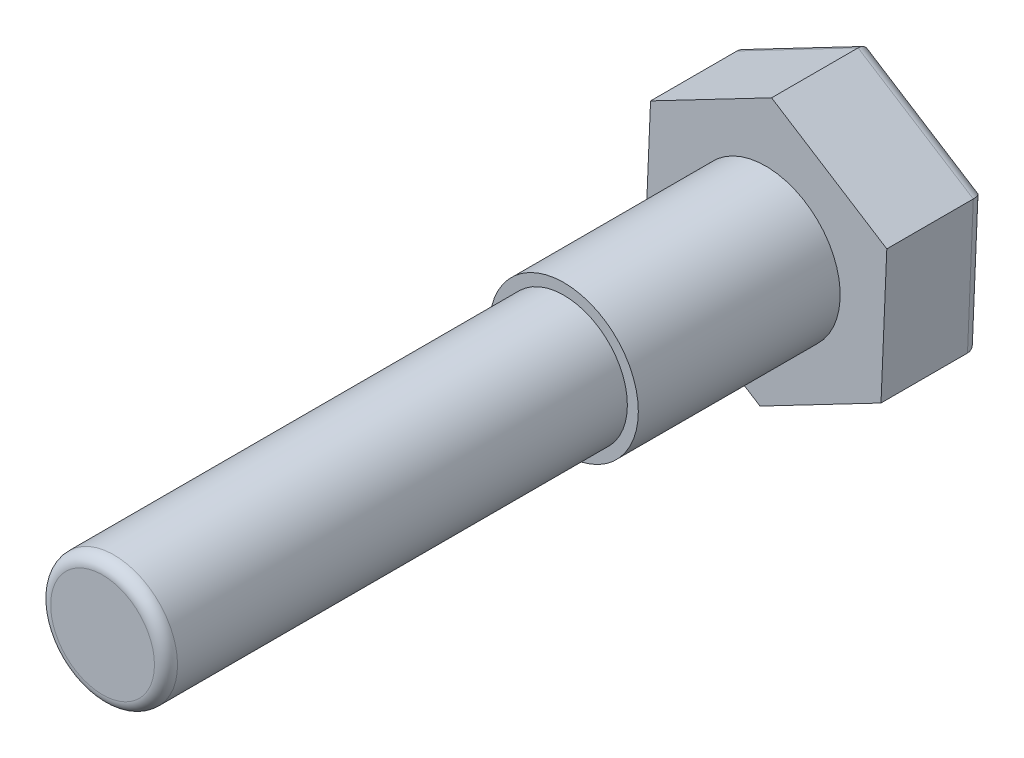
ISO-10303-21;
HEADER;
FILE_DESCRIPTION(('STEP AP214'),'2;1');
FILE_NAME('part.step','',(''),(''),'','','');
FILE_SCHEMA(('AUTOMOTIVE_DESIGN { 1 0 10303 214 1 1 1 1 }'));
ENDSEC;
DATA;
#1=APPLICATION_CONTEXT('core data for automotive mechanical design processes');
#2=APPLICATION_PROTOCOL_DEFINITION('international standard','automotive_design',2000,#1);
#3=PRODUCT_CONTEXT('',#1,'mechanical');
#4=PRODUCT('Part','Part','',(#3));
#5=PRODUCT_RELATED_PRODUCT_CATEGORY('part','',(#4));
#6=PRODUCT_DEFINITION_FORMATION('','',#4);
#7=PRODUCT_DEFINITION_CONTEXT('part definition',#1,'design');
#8=PRODUCT_DEFINITION('design','',#6,#7);
#9=PRODUCT_DEFINITION_SHAPE('','',#8);
#10=(LENGTH_UNIT() NAMED_UNIT(*) SI_UNIT(.MILLI.,.METRE.));
#11=(NAMED_UNIT(*) PLANE_ANGLE_UNIT() SI_UNIT($,.RADIAN.));
#12=(NAMED_UNIT(*) SI_UNIT($,.STERADIAN.) SOLID_ANGLE_UNIT());
#13=UNCERTAINTY_MEASURE_WITH_UNIT(LENGTH_MEASURE(1.E-05),#10,'distance_accuracy_value','');
#14=(GEOMETRIC_REPRESENTATION_CONTEXT(3) GLOBAL_UNCERTAINTY_ASSIGNED_CONTEXT((#13)) GLOBAL_UNIT_ASSIGNED_CONTEXT((#10,
#11,#12)) REPRESENTATION_CONTEXT('',''));
#15=CARTESIAN_POINT('',(0.,0.,0.));
#16=DIRECTION('',(0.,0.,1.));
#17=DIRECTION('',(1.,0.,0.));
#18=AXIS2_PLACEMENT_3D('',#15,#16,#17);
#19=CARTESIAN_POINT('',(19.9787997617734,-12.6957037383635,17.));
#20=DIRECTION('',(-0.999097599975706,0.0424733530909036,0.));
#21=DIRECTION('',(-0.0424733530909036,-0.999097599975706,0.));
#22=AXIS2_PLACEMENT_3D('',#19,#20,#21);
#23=PLANE('',#22);
#24=DIRECTION('',(0.,0.,-1.));
#25=VECTOR('',#24,1.);
#26=CARTESIAN_POINT('',(19.9787997617734,-12.6957037383635,17.));
#27=LINE('',#26,#25);
#28=CARTESIAN_POINT('',(19.9787997617734,-12.6957037383635,17.));
#29=VERTEX_POINT('',#28);
#30=CARTESIAN_POINT('',(19.9787997617734,-12.6957037383635,2.));
#31=VERTEX_POINT('',#30);
#32=EDGE_CURVE('E257',#29,#31,#27,.T.);
#33=ORIENTED_EDGE('',*,*,#32,.T.);
#34=DIRECTION('',(0.0424733530909036,0.999097599975706,0.));
#35=VECTOR('',#34,1.);
#36=CARTESIAN_POINT('',(20.9842018372306,10.9542962616365,2.));
#37=LINE('',#36,#35);
#38=CARTESIAN_POINT('',(20.9842018372306,10.9542962616365,2.));
#39=VERTEX_POINT('',#38);
#40=EDGE_CURVE('E132',#31,#39,#37,.T.);
#41=ORIENTED_EDGE('',*,*,#40,.T.);
#42=DIRECTION('',(0.,0.,-1.));
#43=VECTOR('',#42,1.);
#44=CARTESIAN_POINT('',(20.9842018372306,10.9542962616365,17.));
#45=LINE('',#44,#43);
#46=CARTESIAN_POINT('',(20.9842018372306,10.9542962616365,17.));
#47=VERTEX_POINT('',#46);
#48=EDGE_CURVE('E115',#47,#39,#45,.T.);
#49=ORIENTED_EDGE('',*,*,#48,.F.);
#50=DIRECTION('',(0.0424733530909036,0.999097599975706,0.));
#51=VECTOR('',#50,1.);
#52=CARTESIAN_POINT('',(19.9787997617734,-12.6957037383635,17.));
#53=LINE('',#52,#51);
#54=EDGE_CURVE('E122',#29,#47,#53,.T.);
#55=ORIENTED_EDGE('',*,*,#54,.F.);
#56=EDGE_LOOP('',(#33,#41,#49,#55));
#57=FACE_BOUND('',#56,.T.);
#58=ADVANCED_FACE('F36',(#57),#23,.F.);
#59=CARTESIAN_POINT('',(20.9842018372306,10.9542962616365,17.));
#60=DIRECTION('',(-0.536331802748482,-0.844007225893572,0.));
#61=DIRECTION('',(0.844007225893572,-0.536331802748482,0.));
#62=AXIS2_PLACEMENT_3D('',#59,#60,#61);
#63=PLANE('',#62);
#64=ORIENTED_EDGE('',*,*,#48,.T.);
#65=DIRECTION('',(-0.844007225893572,0.536331802748482,0.));
#66=VECTOR('',#65,1.);
#67=CARTESIAN_POINT('',(1.00540207545719,23.65,2.));
#68=LINE('',#67,#66);
#69=CARTESIAN_POINT('',(1.0054020754572,23.65,2.));
#70=VERTEX_POINT('',#69);
#71=EDGE_CURVE('E136',#39,#70,#68,.T.);
#72=ORIENTED_EDGE('',*,*,#71,.T.);
#73=DIRECTION('',(0.,0.,-1.));
#74=VECTOR('',#73,1.);
#75=CARTESIAN_POINT('',(1.0054020754572,23.65,17.));
#76=LINE('',#75,#74);
#77=CARTESIAN_POINT('',(1.0054020754572,23.65,17.));
#78=VERTEX_POINT('',#77);
#79=EDGE_CURVE('E118',#78,#70,#76,.T.);
#80=ORIENTED_EDGE('',*,*,#79,.F.);
#81=DIRECTION('',(-0.844007225893572,0.536331802748482,0.));
#82=VECTOR('',#81,1.);
#83=CARTESIAN_POINT('',(20.9842018372306,10.9542962616365,17.));
#84=LINE('',#83,#82);
#85=EDGE_CURVE('E110',#47,#78,#84,.T.);
#86=ORIENTED_EDGE('',*,*,#85,.F.);
#87=EDGE_LOOP('',(#64,#72,#80,#86));
#88=FACE_BOUND('',#87,.T.);
#89=ADVANCED_FACE('F112',(#88),#63,.F.);
#90=CARTESIAN_POINT('',(1.0054020754572,23.65,17.));
#91=DIRECTION('',(0.462765797227231,-0.886480578984472,0.));
#92=DIRECTION('',(0.886480578984472,0.462765797227231,0.));
#93=AXIS2_PLACEMENT_3D('',#90,#91,#92);
#94=PLANE('',#93);
#95=ORIENTED_EDGE('',*,*,#79,.T.);
#96=DIRECTION('',(-0.886480578984472,-0.462765797227231,0.));
#97=VECTOR('',#96,1.);
#98=CARTESIAN_POINT('',(-19.9787997617736,12.6957037383632,2.));
#99=LINE('',#98,#97);
#100=CARTESIAN_POINT('',(-19.9787997617736,12.6957037383632,2.));
#101=VERTEX_POINT('',#100);
#102=EDGE_CURVE('E156',#70,#101,#99,.T.);
#103=ORIENTED_EDGE('',*,*,#102,.T.);
#104=DIRECTION('',(0.,0.,-1.));
#105=VECTOR('',#104,1.);
#106=CARTESIAN_POINT('',(-19.9787997617736,12.6957037383632,17.));
#107=LINE('',#106,#105);
#108=CARTESIAN_POINT('',(-19.9787997617736,12.6957037383632,17.));
#109=VERTEX_POINT('',#108);
#110=EDGE_CURVE('E138',#109,#101,#107,.T.);
#111=ORIENTED_EDGE('',*,*,#110,.F.);
#112=DIRECTION('',(-0.886480578984472,-0.462765797227231,0.));
#113=VECTOR('',#112,1.);
#114=CARTESIAN_POINT('',(1.0054020754572,23.65,17.));
#115=LINE('',#114,#113);
#116=EDGE_CURVE('E121',#78,#109,#115,.T.);
#117=ORIENTED_EDGE('',*,*,#116,.F.);
#118=EDGE_LOOP('',(#95,#103,#111,#117));
#119=FACE_BOUND('',#118,.T.);
#120=ADVANCED_FACE('F197',(#119),#94,.F.);
#121=CARTESIAN_POINT('',(-19.9787997617736,12.6957037383632,17.));
#122=DIRECTION('',(0.999097599975706,-0.0424733530908878,0.));
#123=DIRECTION('',(0.0424733530908878,0.999097599975707,0.));
#124=AXIS2_PLACEMENT_3D('',#121,#122,#123);
#125=PLANE('',#124);
#126=ORIENTED_EDGE('',*,*,#110,.T.);
#127=DIRECTION('',(-0.0424733530908878,-0.999097599975707,0.));
#128=VECTOR('',#127,1.);
#129=CARTESIAN_POINT('',(-20.9842018372304,-10.9542962616368,2.));
#130=LINE('',#129,#128);
#131=CARTESIAN_POINT('',(-20.9842018372304,-10.9542962616368,2.));
#132=VERTEX_POINT('',#131);
#133=EDGE_CURVE('E158',#101,#132,#130,.T.);
#134=ORIENTED_EDGE('',*,*,#133,.T.);
#135=DIRECTION('',(0.,0.,-1.));
#136=VECTOR('',#135,1.);
#137=CARTESIAN_POINT('',(-20.9842018372304,-10.9542962616368,17.));
#138=LINE('',#137,#136);
#139=CARTESIAN_POINT('',(-20.9842018372304,-10.9542962616368,17.));
#140=VERTEX_POINT('',#139);
#141=EDGE_CURVE('E261',#140,#132,#138,.T.);
#142=ORIENTED_EDGE('',*,*,#141,.F.);
#143=DIRECTION('',(-0.0424733530908878,-0.999097599975706,0.));
#144=VECTOR('',#143,1.);
#145=CARTESIAN_POINT('',(-19.9787997617736,12.6957037383632,17.));
#146=LINE('',#145,#144);
#147=EDGE_CURVE('E250',#109,#140,#146,.T.);
#148=ORIENTED_EDGE('',*,*,#147,.F.);
#149=EDGE_LOOP('',(#126,#134,#142,#148));
#150=FACE_BOUND('',#149,.T.);
#151=ADVANCED_FACE('F263',(#150),#125,.F.);
#152=CARTESIAN_POINT('',(-20.9842018372304,-10.9542962616368,17.));
#153=DIRECTION('',(0.536331802748476,0.844007225893576,0.));
#154=DIRECTION('',(-0.844007225893576,0.536331802748476,0.));
#155=AXIS2_PLACEMENT_3D('',#152,#153,#154);
#156=PLANE('',#155);
#157=ORIENTED_EDGE('',*,*,#141,.T.);
#158=DIRECTION('',(0.844007225893576,-0.536331802748476,0.));
#159=VECTOR('',#158,1.);
#160=CARTESIAN_POINT('',(-1.00540207545719,-23.65,2.));
#161=LINE('',#160,#159);
#162=CARTESIAN_POINT('',(-1.00540207545719,-23.65,2.));
#163=VERTEX_POINT('',#162);
#164=EDGE_CURVE('E59',#132,#163,#161,.T.);
#165=ORIENTED_EDGE('',*,*,#164,.T.);
#166=DIRECTION('',(0.,0.,-1.));
#167=VECTOR('',#166,1.);
#168=CARTESIAN_POINT('',(-1.00540207545719,-23.65,17.));
#169=LINE('',#168,#167);
#170=CARTESIAN_POINT('',(-1.00540207545719,-23.65,17.));
#171=VERTEX_POINT('',#170);
#172=EDGE_CURVE('E259',#171,#163,#169,.T.);
#173=ORIENTED_EDGE('',*,*,#172,.F.);
#174=DIRECTION('',(0.844007225893576,-0.536331802748476,0.));
#175=VECTOR('',#174,1.);
#176=CARTESIAN_POINT('',(-20.9842018372304,-10.9542962616368,17.));
#177=LINE('',#176,#175);
#178=EDGE_CURVE('E252',#140,#171,#177,.T.);
#179=ORIENTED_EDGE('',*,*,#178,.F.);
#180=EDGE_LOOP('',(#157,#165,#173,#179));
#181=FACE_BOUND('',#180,.T.);
#182=ADVANCED_FACE('F266',(#181),#156,.F.);
#183=CARTESIAN_POINT('',(-1.00540207545719,-23.65,17.));
#184=DIRECTION('',(-0.462765797227224,0.886480578984476,0.));
#185=DIRECTION('',(-0.886480578984476,-0.462765797227224,0.));
#186=AXIS2_PLACEMENT_3D('',#183,#184,#185);
#187=PLANE('',#186);
#188=ORIENTED_EDGE('',*,*,#172,.T.);
#189=DIRECTION('',(0.886480578984476,0.462765797227224,0.));
#190=VECTOR('',#189,1.);
#191=CARTESIAN_POINT('',(19.9787997617734,-12.6957037383635,2.));
#192=LINE('',#191,#190);
#193=EDGE_CURVE('E51',#163,#31,#192,.T.);
#194=ORIENTED_EDGE('',*,*,#193,.T.);
#195=ORIENTED_EDGE('',*,*,#32,.F.);
#196=DIRECTION('',(0.886480578984476,0.462765797227224,0.));
#197=VECTOR('',#196,1.);
#198=CARTESIAN_POINT('',(-1.00540207545719,-23.65,17.));
#199=LINE('',#198,#197);
#200=EDGE_CURVE('E127',#171,#29,#199,.T.);
#201=ORIENTED_EDGE('',*,*,#200,.F.);
#202=EDGE_LOOP('',(#188,#194,#195,#201));
#203=FACE_BOUND('',#202,.T.);
#204=ADVANCED_FACE('F267',(#203),#187,.F.);
#205=CARTESIAN_POINT('',(18.9733976863162,-36.3457037383633,17.));
#206=DIRECTION('',(0.,0.,-1.));
#207=DIRECTION('',(-1.,0.,0.));
#208=AXIS2_PLACEMENT_3D('',#205,#206,#207);
#209=PLANE('',#208);
#210=CARTESIAN_POINT('',(0.,0.,17.));
#211=DIRECTION('',(0.,0.,-1.));
#212=DIRECTION('',(-1.,0.,0.));
#213=AXIS2_PLACEMENT_3D('',#210,#211,#212);
#214=CIRCLE('',#213,12.9);
#215=CARTESIAN_POINT('',(-12.9,0.,17.));
#216=VERTEX_POINT('',#215);
#217=EDGE_CURVE('E133',#216,#216,#214,.F.);
#218=ORIENTED_EDGE('',*,*,#217,.F.);
#219=EDGE_LOOP('',(#218));
#220=FACE_BOUND('',#219,.T.);
#221=ORIENTED_EDGE('',*,*,#54,.T.);
#222=ORIENTED_EDGE('',*,*,#85,.T.);
#223=ORIENTED_EDGE('',*,*,#116,.T.);
#224=ORIENTED_EDGE('',*,*,#147,.T.);
#225=ORIENTED_EDGE('',*,*,#178,.T.);
#226=ORIENTED_EDGE('',*,*,#200,.T.);
#227=EDGE_LOOP('',(#221,#222,#223,#224,#225,#226));
#228=FACE_BOUND('',#227,.T.);
#229=ADVANCED_FACE('F125',(#220,#228),#209,.F.);
#230=CARTESIAN_POINT('',(18.9733976863162,-36.3457037383633,0.));
#231=DIRECTION('',(0.,0.,-1.));
#232=DIRECTION('',(-1.,0.,0.));
#233=AXIS2_PLACEMENT_3D('',#230,#231,#232);
#234=PLANE('',#233);
#235=DIRECTION('',(-0.886480578984472,-0.462765797227231,0.));
#236=VECTOR('',#235,1.);
#237=CARTESIAN_POINT('',(1.93093366991166,21.8770388420311,0.));
#238=LINE('',#237,#236);
#239=CARTESIAN_POINT('',(-18.029648565503,11.4570984955961,0.));
#240=VERTEX_POINT('',#239);
#241=CARTESIAN_POINT('',(0.907314068095531,21.3426829268293,0.));
#242=VERTEX_POINT('',#241);
#243=EDGE_CURVE('E151',#240,#242,#238,.F.);
#244=ORIENTED_EDGE('',*,*,#243,.T.);
#245=DIRECTION('',(-0.844007225893572,0.536331802748482,0.));
#246=VECTOR('',#245,1.);
#247=CARTESIAN_POINT('',(19.9115382317336,9.26628180984933,0.));
#248=LINE('',#247,#246);
#249=CARTESIAN_POINT('',(18.9369626335983,9.88558443123292,0.));
#250=VERTEX_POINT('',#249);
#251=EDGE_CURVE('E153',#242,#250,#248,.F.);
#252=ORIENTED_EDGE('',*,*,#251,.T.);
#253=DIRECTION('',(0.0424733530909036,0.999097599975706,0.));
#254=VECTOR('',#253,1.);
#255=CARTESIAN_POINT('',(17.980604561822,-12.6107570321817,0.));
#256=LINE('',#255,#254);
#257=CARTESIAN_POINT('',(18.0296485655028,-11.4570984955964,0.));
#258=VERTEX_POINT('',#257);
#259=EDGE_CURVE('E143',#250,#258,#256,.F.);
#260=ORIENTED_EDGE('',*,*,#259,.T.);
#261=DIRECTION('',(0.886480578984476,0.462765797227224,0.));
#262=VECTOR('',#261,1.);
#263=CARTESIAN_POINT('',(-1.93093366991164,-21.877038842031,0.));
#264=LINE('',#263,#262);
#265=CARTESIAN_POINT('',(-0.90731406809552,-21.3426829268293,0.));
#266=VERTEX_POINT('',#265);
#267=EDGE_CURVE('E145',#258,#266,#264,.F.);
#268=ORIENTED_EDGE('',*,*,#267,.T.);
#269=DIRECTION('',(0.844007225893576,-0.536331802748476,0.));
#270=VECTOR('',#269,1.);
#271=CARTESIAN_POINT('',(-19.9115382317334,-9.26628180984964,0.));
#272=LINE('',#271,#270);
#273=CARTESIAN_POINT('',(-18.9369626335981,-9.88558443123322,0.));
#274=VERTEX_POINT('',#273);
#275=EDGE_CURVE('E147',#266,#274,#272,.F.);
#276=ORIENTED_EDGE('',*,*,#275,.T.);
#277=DIRECTION('',(-0.0424733530908878,-0.999097599975707,0.));
#278=VECTOR('',#277,1.);
#279=CARTESIAN_POINT('',(-17.9806045618221,12.6107570321814,0.));
#280=LINE('',#279,#278);
#281=EDGE_CURVE('E149',#274,#240,#280,.F.);
#282=ORIENTED_EDGE('',*,*,#281,.T.);
#283=EDGE_LOOP('',(#244,#252,#260,#268,#276,#282));
#284=FACE_BOUND('',#283,.T.);
#285=ADVANCED_FACE('F238',(#284),#234,.T.);
#286=CARTESIAN_POINT('',(0.,0.,52.));
#287=DIRECTION('',(0.,0.,-1.));
#288=DIRECTION('',(-1.,0.,0.));
#289=AXIS2_PLACEMENT_3D('',#286,#287,#288);
#290=CYLINDRICAL_SURFACE('',#289,12.9);
#291=CARTESIAN_POINT('',(0.,0.,52.));
#292=DIRECTION('',(0.,0.,1.));
#293=DIRECTION('',(1.,0.,0.));
#294=AXIS2_PLACEMENT_3D('',#291,#292,#293);
#295=CIRCLE('',#294,12.9);
#296=CARTESIAN_POINT('',(12.9,0.,52.));
#297=VERTEX_POINT('',#296);
#298=EDGE_CURVE('E129',#297,#297,#295,.T.);
#299=ORIENTED_EDGE('',*,*,#298,.F.);
#300=EDGE_LOOP('',(#299));
#301=FACE_BOUND('',#300,.T.);
#302=ORIENTED_EDGE('',*,*,#217,.T.);
#303=EDGE_LOOP('',(#302));
#304=FACE_BOUND('',#303,.T.);
#305=ADVANCED_FACE('F227',(#301,#304),#290,.T.);
#306=CARTESIAN_POINT('',(0.,0.,52.));
#307=DIRECTION('',(0.,0.,1.));
#308=DIRECTION('',(1.,0.,0.));
#309=AXIS2_PLACEMENT_3D('',#306,#307,#308);
#310=PLANE('',#309);
#311=CARTESIAN_POINT('',(0.,0.,52.));
#312=DIRECTION('',(0.,0.,1.));
#313=DIRECTION('',(1.,0.,0.));
#314=AXIS2_PLACEMENT_3D('',#311,#312,#313);
#315=CIRCLE('',#314,11.);
#316=CARTESIAN_POINT('',(11.,0.,52.));
#317=VERTEX_POINT('',#316);
#318=EDGE_CURVE('E166',#317,#317,#315,.T.);
#319=ORIENTED_EDGE('',*,*,#318,.F.);
#320=EDGE_LOOP('',(#319));
#321=FACE_BOUND('',#320,.T.);
#322=ORIENTED_EDGE('',*,*,#298,.T.);
#323=EDGE_LOOP('',(#322));
#324=FACE_BOUND('',#323,.T.);
#325=ADVANCED_FACE('F222',(#321,#324),#310,.T.);
#326=CARTESIAN_POINT('',(-19.9115382317334,-9.26628180984964,2.));
#327=DIRECTION('',(-0.844007225893576,0.536331802748476,0.));
#328=DIRECTION('',(-0.536331802748476,-0.844007225893576,0.));
#329=AXIS2_PLACEMENT_3D('',#326,#327,#328);
#330=CYLINDRICAL_SURFACE('',#329,2.);
#331=CARTESIAN_POINT('',(-18.9369626335981,-9.88558443123322,2.));
#332=DIRECTION('',(-0.462765797227234,0.886480578984471,0.));
#333=DIRECTION('',(-0.886480578984471,-0.462765797227234,0.));
#334=AXIS2_PLACEMENT_3D('',#331,#332,#333);
#335=ELLIPSE('',#334,2.3094010767585,2.);
#336=EDGE_CURVE('E174',#274,#132,#335,.T.);
#337=ORIENTED_EDGE('',*,*,#336,.F.);
#338=ORIENTED_EDGE('',*,*,#275,.F.);
#339=CARTESIAN_POINT('',(-0.90731406809552,-21.3426829268293,2.));
#340=DIRECTION('',(-0.999097599975706,0.0424733530909003,0.));
#341=DIRECTION('',(-0.0424733530909002,-0.999097599975706,0.));
#342=AXIS2_PLACEMENT_3D('',#339,#340,#341);
#343=ELLIPSE('',#342,2.3094010767585,2.);
#344=EDGE_CURVE('E177',#163,#266,#343,.F.);
#345=ORIENTED_EDGE('',*,*,#344,.F.);
#346=ORIENTED_EDGE('',*,*,#164,.F.);
#347=EDGE_LOOP('',(#337,#338,#345,#346));
#348=FACE_BOUND('',#347,.T.);
#349=ADVANCED_FACE('F219',(#348),#330,.T.);
#350=CARTESIAN_POINT('',(-1.93093366991164,-21.877038842031,2.));
#351=DIRECTION('',(-0.886480578984476,-0.462765797227224,0.));
#352=DIRECTION('',(0.462765797227224,-0.886480578984476,0.));
#353=AXIS2_PLACEMENT_3D('',#350,#351,#352);
#354=CYLINDRICAL_SURFACE('',#353,2.);
#355=ORIENTED_EDGE('',*,*,#344,.T.);
#356=ORIENTED_EDGE('',*,*,#267,.F.);
#357=CARTESIAN_POINT('',(18.0296485655028,-11.4570984955964,2.));
#358=DIRECTION('',(-0.536331802748482,-0.844007225893572,0.));
#359=DIRECTION('',(0.844007225893572,-0.536331802748482,0.));
#360=AXIS2_PLACEMENT_3D('',#357,#358,#359);
#361=ELLIPSE('',#360,2.3094010767585,2.);
#362=EDGE_CURVE('E171',#31,#258,#361,.F.);
#363=ORIENTED_EDGE('',*,*,#362,.F.);
#364=ORIENTED_EDGE('',*,*,#193,.F.);
#365=EDGE_LOOP('',(#355,#356,#363,#364));
#366=FACE_BOUND('',#365,.T.);
#367=ADVANCED_FACE('F216',(#366),#354,.T.);
#368=CARTESIAN_POINT('',(-17.9806045618221,12.6107570321814,2.));
#369=DIRECTION('',(0.0424733530908878,0.999097599975707,0.));
#370=DIRECTION('',(-0.999097599975707,0.0424733530908878,0.));
#371=AXIS2_PLACEMENT_3D('',#368,#369,#370);
#372=CYLINDRICAL_SURFACE('',#371,2.);
#373=ORIENTED_EDGE('',*,*,#336,.T.);
#374=ORIENTED_EDGE('',*,*,#133,.F.);
#375=CARTESIAN_POINT('',(-18.029648565503,11.457098495596,2.));
#376=DIRECTION('',(0.536331802748472,0.844007225893579,0.));
#377=DIRECTION('',(-0.844007225893579,0.536331802748472,0.));
#378=AXIS2_PLACEMENT_3D('',#375,#376,#377);
#379=ELLIPSE('',#378,2.30940107675851,2.);
#380=EDGE_CURVE('E168',#240,#101,#379,.T.);
#381=ORIENTED_EDGE('',*,*,#380,.F.);
#382=ORIENTED_EDGE('',*,*,#281,.F.);
#383=EDGE_LOOP('',(#373,#374,#381,#382));
#384=FACE_BOUND('',#383,.T.);
#385=ADVANCED_FACE('F212',(#384),#372,.T.);
#386=CARTESIAN_POINT('',(17.980604561822,-12.6107570321817,2.));
#387=DIRECTION('',(-0.0424733530909036,-0.999097599975706,0.));
#388=DIRECTION('',(0.999097599975706,-0.0424733530909036,0.));
#389=AXIS2_PLACEMENT_3D('',#386,#387,#388);
#390=CYLINDRICAL_SURFACE('',#389,2.);
#391=ORIENTED_EDGE('',*,*,#362,.T.);
#392=ORIENTED_EDGE('',*,*,#259,.F.);
#393=CARTESIAN_POINT('',(18.9369626335983,9.88558443123291,2.));
#394=DIRECTION('',(0.462765797227224,-0.886480578984476,0.));
#395=DIRECTION('',(-0.886480578984476,-0.462765797227224,0.));
#396=AXIS2_PLACEMENT_3D('',#393,#394,#395);
#397=ELLIPSE('',#396,2.3094010767585,2.);
#398=EDGE_CURVE('E165',#39,#250,#397,.F.);
#399=ORIENTED_EDGE('',*,*,#398,.F.);
#400=ORIENTED_EDGE('',*,*,#40,.F.);
#401=EDGE_LOOP('',(#391,#392,#399,#400));
#402=FACE_BOUND('',#401,.T.);
#403=ADVANCED_FACE('F208',(#402),#390,.T.);
#404=CARTESIAN_POINT('',(1.93093366991166,21.8770388420311,2.));
#405=DIRECTION('',(0.886480578984472,0.462765797227231,0.));
#406=DIRECTION('',(-0.462765797227231,0.886480578984472,0.));
#407=AXIS2_PLACEMENT_3D('',#404,#405,#406);
#408=CYLINDRICAL_SURFACE('',#407,2.);
#409=ORIENTED_EDGE('',*,*,#380,.T.);
#410=ORIENTED_EDGE('',*,*,#102,.F.);
#411=CARTESIAN_POINT('',(0.907314068095525,21.3426829268293,2.));
#412=DIRECTION('',(0.999097599975706,-0.0424733530908997,0.));
#413=DIRECTION('',(0.0424733530908995,0.999097599975706,0.));
#414=AXIS2_PLACEMENT_3D('',#411,#412,#413);
#415=ELLIPSE('',#414,2.30940107675851,2.);
#416=EDGE_CURVE('E163',#242,#70,#415,.T.);
#417=ORIENTED_EDGE('',*,*,#416,.F.);
#418=ORIENTED_EDGE('',*,*,#243,.F.);
#419=EDGE_LOOP('',(#409,#410,#417,#418));
#420=FACE_BOUND('',#419,.T.);
#421=ADVANCED_FACE('F204',(#420),#408,.T.);
#422=CARTESIAN_POINT('',(19.9115382317336,9.26628180984933,2.));
#423=DIRECTION('',(0.844007225893572,-0.536331802748482,0.));
#424=DIRECTION('',(0.536331802748482,0.844007225893572,0.));
#425=AXIS2_PLACEMENT_3D('',#422,#423,#424);
#426=CYLINDRICAL_SURFACE('',#425,2.);
#427=ORIENTED_EDGE('',*,*,#398,.T.);
#428=ORIENTED_EDGE('',*,*,#251,.F.);
#429=ORIENTED_EDGE('',*,*,#416,.T.);
#430=ORIENTED_EDGE('',*,*,#71,.F.);
#431=EDGE_LOOP('',(#427,#428,#429,#430));
#432=FACE_BOUND('',#431,.T.);
#433=ADVANCED_FACE('F201',(#432),#426,.T.);
#434=CARTESIAN_POINT('',(0.,0.,132.));
#435=DIRECTION('',(0.,0.,-1.));
#436=DIRECTION('',(-1.,0.,0.));
#437=AXIS2_PLACEMENT_3D('',#434,#435,#436);
#438=CYLINDRICAL_SURFACE('',#437,11.);
#439=CARTESIAN_POINT('',(0.,0.,130.));
#440=DIRECTION('',(0.,0.,1.));
#441=DIRECTION('',(1.,0.,0.));
#442=AXIS2_PLACEMENT_3D('',#439,#440,#441);
#443=CIRCLE('',#442,11.);
#444=CARTESIAN_POINT('',(11.,0.,130.));
#445=VERTEX_POINT('',#444);
#446=EDGE_CURVE('E11',#445,#445,#443,.F.);
#447=ORIENTED_EDGE('',*,*,#446,.T.);
#448=EDGE_LOOP('',(#447));
#449=FACE_BOUND('',#448,.T.);
#450=ORIENTED_EDGE('',*,*,#318,.T.);
#451=EDGE_LOOP('',(#450));
#452=FACE_BOUND('',#451,.T.);
#453=ADVANCED_FACE('F189',(#449,#452),#438,.T.);
#454=CARTESIAN_POINT('',(0.,0.,132.));
#455=DIRECTION('',(0.,0.,1.));
#456=DIRECTION('',(1.,0.,0.));
#457=AXIS2_PLACEMENT_3D('',#454,#455,#456);
#458=PLANE('',#457);
#459=CARTESIAN_POINT('',(0.,0.,132.));
#460=DIRECTION('',(0.,0.,1.));
#461=DIRECTION('',(1.,0.,0.));
#462=AXIS2_PLACEMENT_3D('',#459,#460,#461);
#463=CIRCLE('',#462,9.);
#464=CARTESIAN_POINT('',(9.,0.,132.));
#465=VERTEX_POINT('',#464);
#466=EDGE_CURVE('E44',#465,#465,#463,.T.);
#467=ORIENTED_EDGE('',*,*,#466,.T.);
#468=EDGE_LOOP('',(#467));
#469=FACE_BOUND('',#468,.T.);
#470=ADVANCED_FACE('F182',(#469),#458,.T.);
#471=CARTESIAN_POINT('',(0.,0.,130.));
#472=DIRECTION('',(0.,0.,1.));
#473=DIRECTION('',(1.,0.,0.));
#474=AXIS2_PLACEMENT_3D('',#471,#472,#473);
#475=TOROIDAL_SURFACE('',#474,9.,2.);
#476=ORIENTED_EDGE('',*,*,#446,.F.);
#477=EDGE_LOOP('',(#476));
#478=FACE_BOUND('',#477,.T.);
#479=ORIENTED_EDGE('',*,*,#466,.F.);
#480=EDGE_LOOP('',(#479));
#481=FACE_BOUND('',#480,.T.);
#482=ADVANCED_FACE('F38',(#478,#481),#475,.T.);
#483=CLOSED_SHELL('',(#58,#89,#120,#151,#182,#204,#229,#285,#305,#325,#349,#367,#385,#403,#421,
#433,#453,#470,#482));
#484=MANIFOLD_SOLID_BREP('B2',#483);
#485=ADVANCED_BREP_SHAPE_REPRESENTATION('',(#18,#484),#14);
#486=SHAPE_DEFINITION_REPRESENTATION(#9,#485);
ENDSEC;
END-ISO-10303-21;
